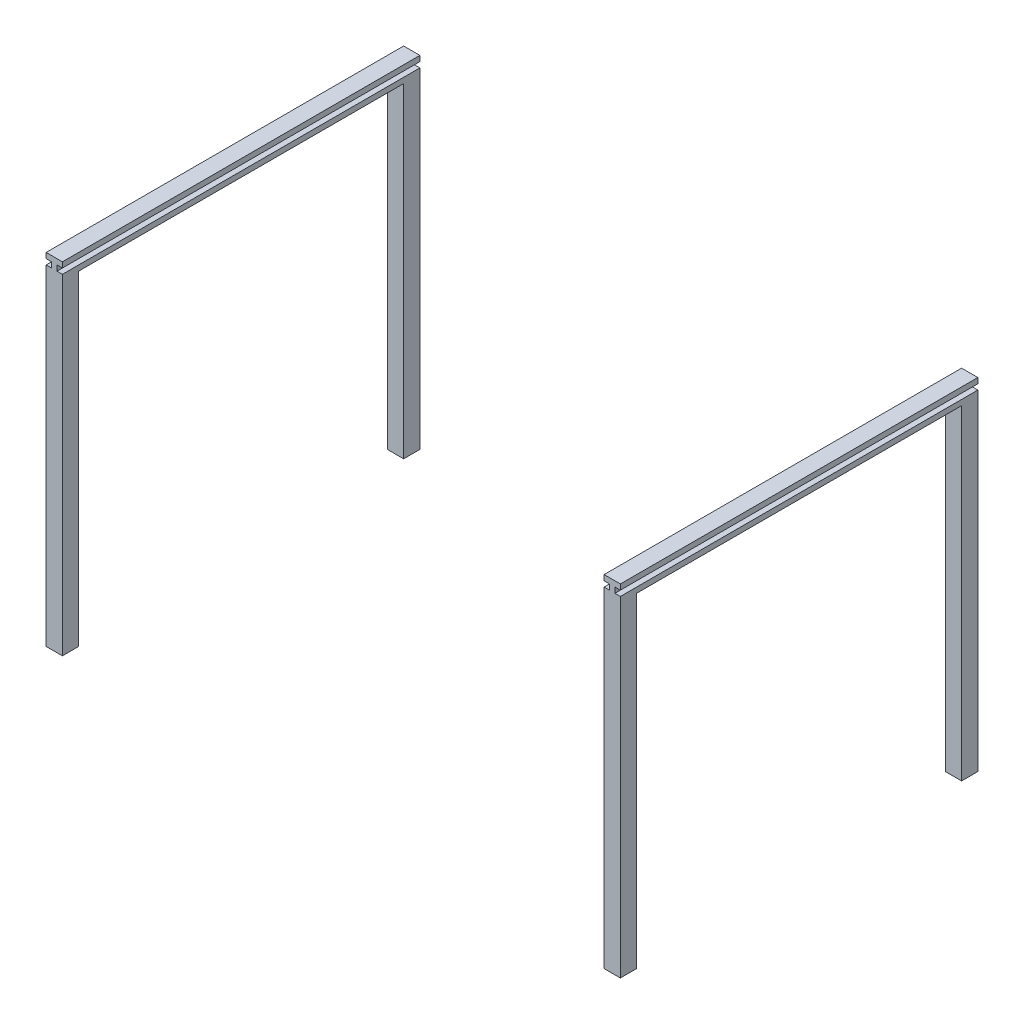
ISO-10303-21;
HEADER;
FILE_DESCRIPTION(('STEP AP214'),'2;1');
FILE_NAME('part.step','',(''),(''),'','','');
FILE_SCHEMA(('AUTOMOTIVE_DESIGN { 1 0 10303 214 1 1 1 1 }'));
ENDSEC;
DATA;
#1=APPLICATION_CONTEXT('core data for automotive mechanical design processes');
#2=APPLICATION_PROTOCOL_DEFINITION('international standard','automotive_design',2000,#1);
#3=PRODUCT_CONTEXT('',#1,'mechanical');
#4=PRODUCT('Part','Part','',(#3));
#5=PRODUCT_RELATED_PRODUCT_CATEGORY('part','',(#4));
#6=PRODUCT_DEFINITION_FORMATION('','',#4);
#7=PRODUCT_DEFINITION_CONTEXT('part definition',#1,'design');
#8=PRODUCT_DEFINITION('design','',#6,#7);
#9=PRODUCT_DEFINITION_SHAPE('','',#8);
#10=(LENGTH_UNIT() NAMED_UNIT(*) SI_UNIT(.MILLI.,.METRE.));
#11=(NAMED_UNIT(*) PLANE_ANGLE_UNIT() SI_UNIT($,.RADIAN.));
#12=(NAMED_UNIT(*) SI_UNIT($,.STERADIAN.) SOLID_ANGLE_UNIT());
#13=UNCERTAINTY_MEASURE_WITH_UNIT(LENGTH_MEASURE(1.E-05),#10,'distance_accuracy_value','');
#14=(GEOMETRIC_REPRESENTATION_CONTEXT(3) GLOBAL_UNCERTAINTY_ASSIGNED_CONTEXT((#13)) GLOBAL_UNIT_ASSIGNED_CONTEXT((#10,
#11,#12)) REPRESENTATION_CONTEXT('',''));
#15=CARTESIAN_POINT('',(0.,0.,0.));
#16=DIRECTION('',(0.,0.,1.));
#17=DIRECTION('',(1.,0.,0.));
#18=AXIS2_PLACEMENT_3D('',#15,#16,#17);
#19=CARTESIAN_POINT('',(2500.,3000.,-1650.));
#20=DIRECTION('',(0.,-1.,0.));
#21=DIRECTION('',(0.,0.,-1.));
#22=AXIS2_PLACEMENT_3D('',#19,#20,#21);
#23=PLANE('',#22);
#24=DIRECTION('',(0.,0.,1.));
#25=VECTOR('',#24,1.);
#26=CARTESIAN_POINT('',(2650.,3000.,-1650.));
#27=LINE('',#26,#25);
#28=CARTESIAN_POINT('',(2650.,3000.,-1500.));
#29=VERTEX_POINT('',#28);
#30=CARTESIAN_POINT('',(2650.,3000.,1500.));
#31=VERTEX_POINT('',#30);
#32=EDGE_CURVE('E117',#29,#31,#27,.T.);
#33=ORIENTED_EDGE('',*,*,#32,.T.);
#34=DIRECTION('',(-1.,0.,0.));
#35=VECTOR('',#34,1.);
#36=CARTESIAN_POINT('',(2650.,3000.,1500.));
#37=LINE('',#36,#35);
#38=CARTESIAN_POINT('',(2500.,3000.,1500.));
#39=VERTEX_POINT('',#38);
#40=EDGE_CURVE('E125',#31,#39,#37,.T.);
#41=ORIENTED_EDGE('',*,*,#40,.T.);
#42=DIRECTION('',(0.,0.,1.));
#43=VECTOR('',#42,1.);
#44=CARTESIAN_POINT('',(2500.,3000.,-1650.));
#45=LINE('',#44,#43);
#46=CARTESIAN_POINT('',(2500.,3000.,-1500.));
#47=VERTEX_POINT('',#46);
#48=EDGE_CURVE('E122',#47,#39,#45,.T.);
#49=ORIENTED_EDGE('',*,*,#48,.F.);
#50=DIRECTION('',(1.,0.,0.));
#51=VECTOR('',#50,1.);
#52=CARTESIAN_POINT('',(2650.,3000.,-1500.));
#53=LINE('',#52,#51);
#54=EDGE_CURVE('E95',#47,#29,#53,.T.);
#55=ORIENTED_EDGE('',*,*,#54,.T.);
#56=EDGE_LOOP('',(#33,#41,#49,#55));
#57=FACE_BOUND('',#56,.T.);
#58=ADVANCED_FACE('F48',(#57),#23,.T.);
#59=CARTESIAN_POINT('',(2650.,3000.,-1650.));
#60=DIRECTION('',(-1.,0.,0.));
#61=DIRECTION('',(0.,0.,1.));
#62=AXIS2_PLACEMENT_3D('',#59,#60,#61);
#63=PLANE('',#62);
#64=DIRECTION('',(0.,0.,-1.));
#65=VECTOR('',#64,1.);
#66=CARTESIAN_POINT('',(2650.,0.,-1650.));
#67=LINE('',#66,#65);
#68=CARTESIAN_POINT('',(2650.,0.,-1500.));
#69=VERTEX_POINT('',#68);
#70=CARTESIAN_POINT('',(2650.,0.,-1650.));
#71=VERTEX_POINT('',#70);
#72=EDGE_CURVE('E103',#69,#71,#67,.T.);
#73=ORIENTED_EDGE('',*,*,#72,.T.);
#74=DIRECTION('',(0.,-1.,0.));
#75=VECTOR('',#74,1.);
#76=CARTESIAN_POINT('',(2650.,3000.,-1650.));
#77=LINE('',#76,#75);
#78=CARTESIAN_POINT('',(2650.,3050.,-1650.));
#79=VERTEX_POINT('',#78);
#80=EDGE_CURVE('E12',#79,#71,#77,.T.);
#81=ORIENTED_EDGE('',*,*,#80,.F.);
#82=DIRECTION('',(0.,0.,1.));
#83=VECTOR('',#82,1.);
#84=CARTESIAN_POINT('',(2650.,3050.,-1650.));
#85=LINE('',#84,#83);
#86=CARTESIAN_POINT('',(2650.,3050.,1650.));
#87=VERTEX_POINT('',#86);
#88=EDGE_CURVE('E132',#79,#87,#85,.T.);
#89=ORIENTED_EDGE('',*,*,#88,.T.);
#90=DIRECTION('',(0.,1.,0.));
#91=VECTOR('',#90,1.);
#92=CARTESIAN_POINT('',(2650.,3000.,1650.));
#93=LINE('',#92,#91);
#94=CARTESIAN_POINT('',(2650.,0.,1650.));
#95=VERTEX_POINT('',#94);
#96=EDGE_CURVE('E215',#95,#87,#93,.T.);
#97=ORIENTED_EDGE('',*,*,#96,.F.);
#98=DIRECTION('',(0.,0.,-1.));
#99=VECTOR('',#98,1.);
#100=CARTESIAN_POINT('',(2650.,0.,1650.));
#101=LINE('',#100,#99);
#102=CARTESIAN_POINT('',(2650.,0.,1500.));
#103=VERTEX_POINT('',#102);
#104=EDGE_CURVE('E289',#95,#103,#101,.T.);
#105=ORIENTED_EDGE('',*,*,#104,.T.);
#106=DIRECTION('',(0.,-1.,0.));
#107=VECTOR('',#106,1.);
#108=CARTESIAN_POINT('',(2650.,3000.,1500.));
#109=LINE('',#108,#107);
#110=EDGE_CURVE('E238',#31,#103,#109,.T.);
#111=ORIENTED_EDGE('',*,*,#110,.F.);
#112=ORIENTED_EDGE('',*,*,#32,.F.);
#113=DIRECTION('',(0.,-1.,0.));
#114=VECTOR('',#113,1.);
#115=CARTESIAN_POINT('',(2650.,3000.,-1500.));
#116=LINE('',#115,#114);
#117=EDGE_CURVE('E98',#29,#69,#116,.T.);
#118=ORIENTED_EDGE('',*,*,#117,.T.);
#119=EDGE_LOOP('',(#73,#81,#89,#97,#105,#111,#112,#118));
#120=FACE_BOUND('',#119,.T.);
#121=ADVANCED_FACE('F50',(#120),#63,.F.);
#122=CARTESIAN_POINT('',(2650.,3000.,-1650.));
#123=DIRECTION('',(0.,0.,1.));
#124=DIRECTION('',(1.,0.,0.));
#125=AXIS2_PLACEMENT_3D('',#122,#123,#124);
#126=PLANE('',#125);
#127=DIRECTION('',(-1.,0.,0.));
#128=VECTOR('',#127,1.);
#129=CARTESIAN_POINT('',(2650.,0.,-1650.));
#130=LINE('',#129,#128);
#131=CARTESIAN_POINT('',(2500.,0.,-1650.));
#132=VERTEX_POINT('',#131);
#133=EDGE_CURVE('E88',#71,#132,#130,.T.);
#134=ORIENTED_EDGE('',*,*,#133,.T.);
#135=DIRECTION('',(0.,-1.,0.));
#136=VECTOR('',#135,1.);
#137=CARTESIAN_POINT('',(2500.,3000.,-1650.));
#138=LINE('',#137,#136);
#139=CARTESIAN_POINT('',(2500.,3050.,-1650.));
#140=VERTEX_POINT('',#139);
#141=EDGE_CURVE('E58',#140,#132,#138,.T.);
#142=ORIENTED_EDGE('',*,*,#141,.F.);
#143=DIRECTION('',(-1.,0.,0.));
#144=VECTOR('',#143,1.);
#145=CARTESIAN_POINT('',(2500.,3050.,-1650.));
#146=LINE('',#145,#144);
#147=CARTESIAN_POINT('',(2550.,3050.,-1650.));
#148=VERTEX_POINT('',#147);
#149=EDGE_CURVE('E256',#148,#140,#146,.T.);
#150=ORIENTED_EDGE('',*,*,#149,.F.);
#151=DIRECTION('',(0.,-1.,0.));
#152=VECTOR('',#151,1.);
#153=CARTESIAN_POINT('',(2550.,3050.,-1650.));
#154=LINE('',#153,#152);
#155=CARTESIAN_POINT('',(2550.,3100.,-1650.));
#156=VERTEX_POINT('',#155);
#157=EDGE_CURVE('E260',#156,#148,#154,.T.);
#158=ORIENTED_EDGE('',*,*,#157,.F.);
#159=DIRECTION('',(1.,0.,0.));
#160=VECTOR('',#159,1.);
#161=CARTESIAN_POINT('',(2550.,3100.,-1650.));
#162=LINE('',#161,#160);
#163=CARTESIAN_POINT('',(2500.,3100.,-1650.));
#164=VERTEX_POINT('',#163);
#165=EDGE_CURVE('E264',#164,#156,#162,.T.);
#166=ORIENTED_EDGE('',*,*,#165,.F.);
#167=DIRECTION('',(0.,-1.,0.));
#168=VECTOR('',#167,1.);
#169=CARTESIAN_POINT('',(2500.,3100.,-1650.));
#170=LINE('',#169,#168);
#171=CARTESIAN_POINT('',(2500.,3150.,-1650.));
#172=VERTEX_POINT('',#171);
#173=EDGE_CURVE('E200',#172,#164,#170,.T.);
#174=ORIENTED_EDGE('',*,*,#173,.F.);
#175=DIRECTION('',(-1.,0.,0.));
#176=VECTOR('',#175,1.);
#177=CARTESIAN_POINT('',(2500.,3150.,-1650.));
#178=LINE('',#177,#176);
#179=CARTESIAN_POINT('',(2650.,3150.,-1650.));
#180=VERTEX_POINT('',#179);
#181=EDGE_CURVE('E149',#180,#172,#178,.T.);
#182=ORIENTED_EDGE('',*,*,#181,.F.);
#183=DIRECTION('',(0.,1.,0.));
#184=VECTOR('',#183,1.);
#185=CARTESIAN_POINT('',(2650.,3100.,-1650.));
#186=LINE('',#185,#184);
#187=CARTESIAN_POINT('',(2650.,3100.,-1650.));
#188=VERTEX_POINT('',#187);
#189=EDGE_CURVE('E242',#188,#180,#186,.T.);
#190=ORIENTED_EDGE('',*,*,#189,.F.);
#191=DIRECTION('',(1.,0.,0.));
#192=VECTOR('',#191,1.);
#193=CARTESIAN_POINT('',(2600.,3100.,-1650.));
#194=LINE('',#193,#192);
#195=CARTESIAN_POINT('',(2600.,3100.,-1650.));
#196=VERTEX_POINT('',#195);
#197=EDGE_CURVE('E246',#196,#188,#194,.T.);
#198=ORIENTED_EDGE('',*,*,#197,.F.);
#199=DIRECTION('',(0.,1.,0.));
#200=VECTOR('',#199,1.);
#201=CARTESIAN_POINT('',(2600.,3050.,-1650.));
#202=LINE('',#201,#200);
#203=CARTESIAN_POINT('',(2600.,3050.,-1650.));
#204=VERTEX_POINT('',#203);
#205=EDGE_CURVE('E250',#204,#196,#202,.T.);
#206=ORIENTED_EDGE('',*,*,#205,.F.);
#207=DIRECTION('',(-1.,0.,0.));
#208=VECTOR('',#207,1.);
#209=CARTESIAN_POINT('',(2650.,3050.,-1650.));
#210=LINE('',#209,#208);
#211=EDGE_CURVE('E162',#79,#204,#210,.T.);
#212=ORIENTED_EDGE('',*,*,#211,.F.);
#213=ORIENTED_EDGE('',*,*,#80,.T.);
#214=EDGE_LOOP('',(#134,#142,#150,#158,#166,#174,#182,#190,#198,#206,#212,#213));
#215=FACE_BOUND('',#214,.T.);
#216=ADVANCED_FACE('F155',(#215),#126,.F.);
#217=CARTESIAN_POINT('',(2500.,3000.,-1650.));
#218=DIRECTION('',(1.,0.,0.));
#219=DIRECTION('',(0.,0.,-1.));
#220=AXIS2_PLACEMENT_3D('',#217,#218,#219);
#221=PLANE('',#220);
#222=DIRECTION('',(0.,0.,1.));
#223=VECTOR('',#222,1.);
#224=CARTESIAN_POINT('',(2500.,0.,-1650.));
#225=LINE('',#224,#223);
#226=CARTESIAN_POINT('',(2500.,0.,-1500.));
#227=VERTEX_POINT('',#226);
#228=EDGE_CURVE('E80',#132,#227,#225,.T.);
#229=ORIENTED_EDGE('',*,*,#228,.T.);
#230=DIRECTION('',(0.,-1.,0.));
#231=VECTOR('',#230,1.);
#232=CARTESIAN_POINT('',(2500.,3000.,-1500.));
#233=LINE('',#232,#231);
#234=EDGE_CURVE('E65',#47,#227,#233,.T.);
#235=ORIENTED_EDGE('',*,*,#234,.F.);
#236=ORIENTED_EDGE('',*,*,#48,.T.);
#237=DIRECTION('',(0.,-1.,0.));
#238=VECTOR('',#237,1.);
#239=CARTESIAN_POINT('',(2500.,3000.,1500.));
#240=LINE('',#239,#238);
#241=CARTESIAN_POINT('',(2500.,0.,1500.));
#242=VERTEX_POINT('',#241);
#243=EDGE_CURVE('E274',#39,#242,#240,.T.);
#244=ORIENTED_EDGE('',*,*,#243,.T.);
#245=DIRECTION('',(0.,0.,1.));
#246=VECTOR('',#245,1.);
#247=CARTESIAN_POINT('',(2500.,0.,1650.));
#248=LINE('',#247,#246);
#249=CARTESIAN_POINT('',(2500.,0.,1650.));
#250=VERTEX_POINT('',#249);
#251=EDGE_CURVE('E281',#242,#250,#248,.T.);
#252=ORIENTED_EDGE('',*,*,#251,.T.);
#253=DIRECTION('',(0.,-1.,0.));
#254=VECTOR('',#253,1.);
#255=CARTESIAN_POINT('',(2500.,3000.,1650.));
#256=LINE('',#255,#254);
#257=CARTESIAN_POINT('',(2500.,3050.,1650.));
#258=VERTEX_POINT('',#257);
#259=EDGE_CURVE('E218',#258,#250,#256,.T.);
#260=ORIENTED_EDGE('',*,*,#259,.F.);
#261=DIRECTION('',(0.,0.,1.));
#262=VECTOR('',#261,1.);
#263=CARTESIAN_POINT('',(2500.,3050.,-1650.));
#264=LINE('',#263,#262);
#265=EDGE_CURVE('E128',#140,#258,#264,.T.);
#266=ORIENTED_EDGE('',*,*,#265,.F.);
#267=ORIENTED_EDGE('',*,*,#141,.T.);
#268=EDGE_LOOP('',(#229,#235,#236,#244,#252,#260,#266,#267));
#269=FACE_BOUND('',#268,.T.);
#270=ADVANCED_FACE('F81',(#269),#221,.F.);
#271=CARTESIAN_POINT('',(2650.,3000.,-1500.));
#272=DIRECTION('',(0.,0.,-1.));
#273=DIRECTION('',(-1.,0.,0.));
#274=AXIS2_PLACEMENT_3D('',#271,#272,#273);
#275=PLANE('',#274);
#276=DIRECTION('',(1.,0.,0.));
#277=VECTOR('',#276,1.);
#278=CARTESIAN_POINT('',(2650.,0.,-1500.));
#279=LINE('',#278,#277);
#280=EDGE_CURVE('E87',#227,#69,#279,.T.);
#281=ORIENTED_EDGE('',*,*,#280,.T.);
#282=ORIENTED_EDGE('',*,*,#117,.F.);
#283=ORIENTED_EDGE('',*,*,#54,.F.);
#284=ORIENTED_EDGE('',*,*,#234,.T.);
#285=EDGE_LOOP('',(#281,#282,#283,#284));
#286=FACE_BOUND('',#285,.T.);
#287=ADVANCED_FACE('F91',(#286),#275,.F.);
#288=CARTESIAN_POINT('',(0.,0.,0.));
#289=DIRECTION('',(0.,-1.,0.));
#290=DIRECTION('',(0.,0.,-1.));
#291=AXIS2_PLACEMENT_3D('',#288,#289,#290);
#292=PLANE('',#291);
#293=ORIENTED_EDGE('',*,*,#72,.F.);
#294=ORIENTED_EDGE('',*,*,#280,.F.);
#295=ORIENTED_EDGE('',*,*,#228,.F.);
#296=ORIENTED_EDGE('',*,*,#133,.F.);
#297=EDGE_LOOP('',(#293,#294,#295,#296));
#298=FACE_BOUND('',#297,.T.);
#299=ADVANCED_FACE('F101',(#298),#292,.T.);
#300=CARTESIAN_POINT('',(2500.,3100.,-1650.));
#301=DIRECTION('',(-1.,0.,0.));
#302=DIRECTION('',(0.,0.,1.));
#303=AXIS2_PLACEMENT_3D('',#300,#301,#302);
#304=PLANE('',#303);
#305=DIRECTION('',(0.,-1.,0.));
#306=VECTOR('',#305,1.);
#307=CARTESIAN_POINT('',(2500.,3100.,1650.));
#308=LINE('',#307,#306);
#309=CARTESIAN_POINT('',(2500.,3150.,1650.));
#310=VERTEX_POINT('',#309);
#311=CARTESIAN_POINT('',(2500.,3100.,1650.));
#312=VERTEX_POINT('',#311);
#313=EDGE_CURVE('E234',#310,#312,#308,.T.);
#314=ORIENTED_EDGE('',*,*,#313,.F.);
#315=DIRECTION('',(0.,0.,1.));
#316=VECTOR('',#315,1.);
#317=CARTESIAN_POINT('',(2500.,3150.,-1650.));
#318=LINE('',#317,#316);
#319=EDGE_CURVE('E152',#172,#310,#318,.T.);
#320=ORIENTED_EDGE('',*,*,#319,.F.);
#321=ORIENTED_EDGE('',*,*,#173,.T.);
#322=DIRECTION('',(0.,0.,1.));
#323=VECTOR('',#322,1.);
#324=CARTESIAN_POINT('',(2500.,3100.,-1650.));
#325=LINE('',#324,#323);
#326=EDGE_CURVE('E146',#164,#312,#325,.T.);
#327=ORIENTED_EDGE('',*,*,#326,.T.);
#328=EDGE_LOOP('',(#314,#320,#321,#327));
#329=FACE_BOUND('',#328,.T.);
#330=ADVANCED_FACE('F357',(#329),#304,.T.);
#331=CARTESIAN_POINT('',(2500.,3150.,-1650.));
#332=DIRECTION('',(0.,1.,0.));
#333=DIRECTION('',(0.,0.,1.));
#334=AXIS2_PLACEMENT_3D('',#331,#332,#333);
#335=PLANE('',#334);
#336=DIRECTION('',(-1.,0.,0.));
#337=VECTOR('',#336,1.);
#338=CARTESIAN_POINT('',(2500.,3150.,1650.));
#339=LINE('',#338,#337);
#340=CARTESIAN_POINT('',(2650.,3150.,1650.));
#341=VERTEX_POINT('',#340);
#342=EDGE_CURVE('E196',#341,#310,#339,.T.);
#343=ORIENTED_EDGE('',*,*,#342,.F.);
#344=DIRECTION('',(0.,0.,1.));
#345=VECTOR('',#344,1.);
#346=CARTESIAN_POINT('',(2650.,3150.,-1650.));
#347=LINE('',#346,#345);
#348=EDGE_CURVE('E189',#180,#341,#347,.T.);
#349=ORIENTED_EDGE('',*,*,#348,.F.);
#350=ORIENTED_EDGE('',*,*,#181,.T.);
#351=ORIENTED_EDGE('',*,*,#319,.T.);
#352=EDGE_LOOP('',(#343,#349,#350,#351));
#353=FACE_BOUND('',#352,.T.);
#354=ADVANCED_FACE('F353',(#353),#335,.T.);
#355=CARTESIAN_POINT('',(2650.,3100.,-1650.));
#356=DIRECTION('',(1.,0.,0.));
#357=DIRECTION('',(0.,0.,-1.));
#358=AXIS2_PLACEMENT_3D('',#355,#356,#357);
#359=PLANE('',#358);
#360=DIRECTION('',(0.,1.,0.));
#361=VECTOR('',#360,1.);
#362=CARTESIAN_POINT('',(2650.,3100.,1650.));
#363=LINE('',#362,#361);
#364=CARTESIAN_POINT('',(2650.,3100.,1650.));
#365=VERTEX_POINT('',#364);
#366=EDGE_CURVE('E201',#365,#341,#363,.T.);
#367=ORIENTED_EDGE('',*,*,#366,.F.);
#368=DIRECTION('',(0.,0.,1.));
#369=VECTOR('',#368,1.);
#370=CARTESIAN_POINT('',(2650.,3100.,-1650.));
#371=LINE('',#370,#369);
#372=EDGE_CURVE('E185',#188,#365,#371,.T.);
#373=ORIENTED_EDGE('',*,*,#372,.F.);
#374=ORIENTED_EDGE('',*,*,#189,.T.);
#375=ORIENTED_EDGE('',*,*,#348,.T.);
#376=EDGE_LOOP('',(#367,#373,#374,#375));
#377=FACE_BOUND('',#376,.T.);
#378=ADVANCED_FACE('F364',(#377),#359,.T.);
#379=CARTESIAN_POINT('',(2600.,3100.,-1650.));
#380=DIRECTION('',(0.,-1.,0.));
#381=DIRECTION('',(0.,0.,-1.));
#382=AXIS2_PLACEMENT_3D('',#379,#380,#381);
#383=PLANE('',#382);
#384=DIRECTION('',(1.,0.,0.));
#385=VECTOR('',#384,1.);
#386=CARTESIAN_POINT('',(2600.,3100.,1650.));
#387=LINE('',#386,#385);
#388=CARTESIAN_POINT('',(2600.,3100.,1650.));
#389=VERTEX_POINT('',#388);
#390=EDGE_CURVE('E205',#389,#365,#387,.T.);
#391=ORIENTED_EDGE('',*,*,#390,.F.);
#392=DIRECTION('',(0.,0.,1.));
#393=VECTOR('',#392,1.);
#394=CARTESIAN_POINT('',(2600.,3100.,-1650.));
#395=LINE('',#394,#393);
#396=EDGE_CURVE('E179',#196,#389,#395,.T.);
#397=ORIENTED_EDGE('',*,*,#396,.F.);
#398=ORIENTED_EDGE('',*,*,#197,.T.);
#399=ORIENTED_EDGE('',*,*,#372,.T.);
#400=EDGE_LOOP('',(#391,#397,#398,#399));
#401=FACE_BOUND('',#400,.T.);
#402=ADVANCED_FACE('F382',(#401),#383,.T.);
#403=CARTESIAN_POINT('',(2600.,3050.,-1650.));
#404=DIRECTION('',(1.,0.,0.));
#405=DIRECTION('',(0.,0.,-1.));
#406=AXIS2_PLACEMENT_3D('',#403,#404,#405);
#407=PLANE('',#406);
#408=DIRECTION('',(0.,1.,0.));
#409=VECTOR('',#408,1.);
#410=CARTESIAN_POINT('',(2600.,3050.,1650.));
#411=LINE('',#410,#409);
#412=CARTESIAN_POINT('',(2600.,3050.,1650.));
#413=VERTEX_POINT('',#412);
#414=EDGE_CURVE('E209',#413,#389,#411,.T.);
#415=ORIENTED_EDGE('',*,*,#414,.F.);
#416=DIRECTION('',(0.,0.,1.));
#417=VECTOR('',#416,1.);
#418=CARTESIAN_POINT('',(2600.,3050.,-1650.));
#419=LINE('',#418,#417);
#420=EDGE_CURVE('E177',#204,#413,#419,.T.);
#421=ORIENTED_EDGE('',*,*,#420,.F.);
#422=ORIENTED_EDGE('',*,*,#205,.T.);
#423=ORIENTED_EDGE('',*,*,#396,.T.);
#424=EDGE_LOOP('',(#415,#421,#422,#423));
#425=FACE_BOUND('',#424,.T.);
#426=ADVANCED_FACE('F380',(#425),#407,.T.);
#427=CARTESIAN_POINT('',(2650.,3050.,-1650.));
#428=DIRECTION('',(0.,1.,0.));
#429=DIRECTION('',(0.,0.,1.));
#430=AXIS2_PLACEMENT_3D('',#427,#428,#429);
#431=PLANE('',#430);
#432=DIRECTION('',(-1.,0.,0.));
#433=VECTOR('',#432,1.);
#434=CARTESIAN_POINT('',(2650.,3050.,1650.));
#435=LINE('',#434,#433);
#436=EDGE_CURVE('E174',#87,#413,#435,.T.);
#437=ORIENTED_EDGE('',*,*,#436,.F.);
#438=ORIENTED_EDGE('',*,*,#88,.F.);
#439=ORIENTED_EDGE('',*,*,#211,.T.);
#440=ORIENTED_EDGE('',*,*,#420,.T.);
#441=EDGE_LOOP('',(#437,#438,#439,#440));
#442=FACE_BOUND('',#441,.T.);
#443=ADVANCED_FACE('F171',(#442),#431,.T.);
#444=CARTESIAN_POINT('',(2500.,3050.,-1650.));
#445=DIRECTION('',(0.,1.,0.));
#446=DIRECTION('',(0.,0.,1.));
#447=AXIS2_PLACEMENT_3D('',#444,#445,#446);
#448=PLANE('',#447);
#449=DIRECTION('',(-1.,0.,0.));
#450=VECTOR('',#449,1.);
#451=CARTESIAN_POINT('',(2500.,3050.,1650.));
#452=LINE('',#451,#450);
#453=CARTESIAN_POINT('',(2550.,3050.,1650.));
#454=VERTEX_POINT('',#453);
#455=EDGE_CURVE('E222',#454,#258,#452,.T.);
#456=ORIENTED_EDGE('',*,*,#455,.F.);
#457=DIRECTION('',(0.,0.,1.));
#458=VECTOR('',#457,1.);
#459=CARTESIAN_POINT('',(2550.,3050.,-1650.));
#460=LINE('',#459,#458);
#461=EDGE_CURVE('E135',#148,#454,#460,.T.);
#462=ORIENTED_EDGE('',*,*,#461,.F.);
#463=ORIENTED_EDGE('',*,*,#149,.T.);
#464=ORIENTED_EDGE('',*,*,#265,.T.);
#465=EDGE_LOOP('',(#456,#462,#463,#464));
#466=FACE_BOUND('',#465,.T.);
#467=ADVANCED_FACE('F376',(#466),#448,.T.);
#468=CARTESIAN_POINT('',(2550.,3050.,-1650.));
#469=DIRECTION('',(-1.,0.,0.));
#470=DIRECTION('',(0.,0.,1.));
#471=AXIS2_PLACEMENT_3D('',#468,#469,#470);
#472=PLANE('',#471);
#473=DIRECTION('',(0.,-1.,0.));
#474=VECTOR('',#473,1.);
#475=CARTESIAN_POINT('',(2550.,3050.,1650.));
#476=LINE('',#475,#474);
#477=CARTESIAN_POINT('',(2550.,3100.,1650.));
#478=VERTEX_POINT('',#477);
#479=EDGE_CURVE('E226',#478,#454,#476,.T.);
#480=ORIENTED_EDGE('',*,*,#479,.F.);
#481=DIRECTION('',(0.,0.,1.));
#482=VECTOR('',#481,1.);
#483=CARTESIAN_POINT('',(2550.,3100.,-1650.));
#484=LINE('',#483,#482);
#485=EDGE_CURVE('E142',#156,#478,#484,.T.);
#486=ORIENTED_EDGE('',*,*,#485,.F.);
#487=ORIENTED_EDGE('',*,*,#157,.T.);
#488=ORIENTED_EDGE('',*,*,#461,.T.);
#489=EDGE_LOOP('',(#480,#486,#487,#488));
#490=FACE_BOUND('',#489,.T.);
#491=ADVANCED_FACE('F374',(#490),#472,.T.);
#492=CARTESIAN_POINT('',(2550.,3100.,-1650.));
#493=DIRECTION('',(0.,-1.,0.));
#494=DIRECTION('',(0.,0.,-1.));
#495=AXIS2_PLACEMENT_3D('',#492,#493,#494);
#496=PLANE('',#495);
#497=DIRECTION('',(1.,0.,0.));
#498=VECTOR('',#497,1.);
#499=CARTESIAN_POINT('',(2550.,3100.,1650.));
#500=LINE('',#499,#498);
#501=EDGE_CURVE('E230',#312,#478,#500,.T.);
#502=ORIENTED_EDGE('',*,*,#501,.F.);
#503=ORIENTED_EDGE('',*,*,#326,.F.);
#504=ORIENTED_EDGE('',*,*,#165,.T.);
#505=ORIENTED_EDGE('',*,*,#485,.T.);
#506=EDGE_LOOP('',(#502,#503,#504,#505));
#507=FACE_BOUND('',#506,.T.);
#508=ADVANCED_FACE('F370',(#507),#496,.T.);
#509=CARTESIAN_POINT('',(0.,0.,1650.));
#510=DIRECTION('',(0.,0.,-1.));
#511=DIRECTION('',(-1.,0.,0.));
#512=AXIS2_PLACEMENT_3D('',#509,#510,#511);
#513=PLANE('',#512);
#514=ORIENTED_EDGE('',*,*,#313,.T.);
#515=ORIENTED_EDGE('',*,*,#501,.T.);
#516=ORIENTED_EDGE('',*,*,#479,.T.);
#517=ORIENTED_EDGE('',*,*,#455,.T.);
#518=ORIENTED_EDGE('',*,*,#259,.T.);
#519=DIRECTION('',(1.,0.,0.));
#520=VECTOR('',#519,1.);
#521=CARTESIAN_POINT('',(2650.,0.,1650.));
#522=LINE('',#521,#520);
#523=EDGE_CURVE('E277',#250,#95,#522,.T.);
#524=ORIENTED_EDGE('',*,*,#523,.T.);
#525=ORIENTED_EDGE('',*,*,#96,.T.);
#526=ORIENTED_EDGE('',*,*,#436,.T.);
#527=ORIENTED_EDGE('',*,*,#414,.T.);
#528=ORIENTED_EDGE('',*,*,#390,.T.);
#529=ORIENTED_EDGE('',*,*,#366,.T.);
#530=ORIENTED_EDGE('',*,*,#342,.T.);
#531=EDGE_LOOP('',(#514,#515,#516,#517,#518,#524,#525,#526,#527,#528,#529,#530));
#532=FACE_BOUND('',#531,.T.);
#533=ADVANCED_FACE('F360',(#532),#513,.F.);
#534=CARTESIAN_POINT('',(2650.,3000.,1500.));
#535=DIRECTION('',(0.,0.,1.));
#536=DIRECTION('',(1.,0.,0.));
#537=AXIS2_PLACEMENT_3D('',#534,#535,#536);
#538=PLANE('',#537);
#539=DIRECTION('',(-1.,0.,0.));
#540=VECTOR('',#539,1.);
#541=CARTESIAN_POINT('',(2650.,0.,1500.));
#542=LINE('',#541,#540);
#543=EDGE_CURVE('E285',#103,#242,#542,.T.);
#544=ORIENTED_EDGE('',*,*,#543,.T.);
#545=ORIENTED_EDGE('',*,*,#243,.F.);
#546=ORIENTED_EDGE('',*,*,#40,.F.);
#547=ORIENTED_EDGE('',*,*,#110,.T.);
#548=EDGE_LOOP('',(#544,#545,#546,#547));
#549=FACE_BOUND('',#548,.T.);
#550=ADVANCED_FACE('F479',(#549),#538,.F.);
#551=CARTESIAN_POINT('',(0.,0.,0.));
#552=DIRECTION('',(0.,1.,0.));
#553=DIRECTION('',(0.,0.,1.));
#554=AXIS2_PLACEMENT_3D('',#551,#552,#553);
#555=PLANE('',#554);
#556=ORIENTED_EDGE('',*,*,#104,.F.);
#557=ORIENTED_EDGE('',*,*,#523,.F.);
#558=ORIENTED_EDGE('',*,*,#251,.F.);
#559=ORIENTED_EDGE('',*,*,#543,.F.);
#560=EDGE_LOOP('',(#556,#557,#558,#559));
#561=FACE_BOUND('',#560,.T.);
#562=ADVANCED_FACE('F302',(#561),#555,.F.);
#563=CLOSED_SHELL('',(#58,#121,#216,#270,#287,#299,#330,#354,#378,#402,#426,#443,#467,#491,#508,
#533,#550,#562));
#564=MANIFOLD_SOLID_BREP('B2',#563);
#565=CARTESIAN_POINT('',(-2500.,3000.,-1650.));
#566=DIRECTION('',(0.,-1.,0.));
#567=DIRECTION('',(0.,0.,-1.));
#568=AXIS2_PLACEMENT_3D('',#565,#566,#567);
#569=PLANE('',#568);
#570=DIRECTION('',(0.,0.,1.));
#571=VECTOR('',#570,1.);
#572=CARTESIAN_POINT('',(-2500.,3000.,-1650.));
#573=LINE('',#572,#571);
#574=CARTESIAN_POINT('',(-2500.,3000.,-1500.));
#575=VERTEX_POINT('',#574);
#576=CARTESIAN_POINT('',(-2500.,3000.,1500.));
#577=VERTEX_POINT('',#576);
#578=EDGE_CURVE('E611',#575,#577,#573,.T.);
#579=ORIENTED_EDGE('',*,*,#578,.T.);
#580=DIRECTION('',(-1.,0.,0.));
#581=VECTOR('',#580,1.);
#582=CARTESIAN_POINT('',(-2650.,3000.,1500.));
#583=LINE('',#582,#581);
#584=CARTESIAN_POINT('',(-2650.,3000.,1500.));
#585=VERTEX_POINT('',#584);
#586=EDGE_CURVE('E619',#577,#585,#583,.T.);
#587=ORIENTED_EDGE('',*,*,#586,.T.);
#588=DIRECTION('',(0.,0.,1.));
#589=VECTOR('',#588,1.);
#590=CARTESIAN_POINT('',(-2650.,3000.,-1650.));
#591=LINE('',#590,#589);
#592=CARTESIAN_POINT('',(-2650.,3000.,-1500.));
#593=VERTEX_POINT('',#592);
#594=EDGE_CURVE('E616',#593,#585,#591,.T.);
#595=ORIENTED_EDGE('',*,*,#594,.F.);
#596=DIRECTION('',(1.,0.,0.));
#597=VECTOR('',#596,1.);
#598=CARTESIAN_POINT('',(-2650.,3000.,-1500.));
#599=LINE('',#598,#597);
#600=EDGE_CURVE('E594',#593,#575,#599,.T.);
#601=ORIENTED_EDGE('',*,*,#600,.T.);
#602=EDGE_LOOP('',(#579,#587,#595,#601));
#603=FACE_BOUND('',#602,.T.);
#604=ADVANCED_FACE('F549',(#603),#569,.T.);
#605=CARTESIAN_POINT('',(-2500.,3000.,-1650.));
#606=DIRECTION('',(-1.,0.,0.));
#607=DIRECTION('',(0.,0.,1.));
#608=AXIS2_PLACEMENT_3D('',#605,#606,#607);
#609=PLANE('',#608);
#610=DIRECTION('',(0.,0.,-1.));
#611=VECTOR('',#610,1.);
#612=CARTESIAN_POINT('',(-2500.,0.,-1650.));
#613=LINE('',#612,#611);
#614=CARTESIAN_POINT('',(-2500.,0.,-1500.));
#615=VERTEX_POINT('',#614);
#616=CARTESIAN_POINT('',(-2500.,0.,-1650.));
#617=VERTEX_POINT('',#616);
#618=EDGE_CURVE('E601',#615,#617,#613,.T.);
#619=ORIENTED_EDGE('',*,*,#618,.T.);
#620=DIRECTION('',(0.,-1.,0.));
#621=VECTOR('',#620,1.);
#622=CARTESIAN_POINT('',(-2500.,3000.,-1650.));
#623=LINE('',#622,#621);
#624=CARTESIAN_POINT('',(-2500.,3050.,-1650.));
#625=VERTEX_POINT('',#624);
#626=EDGE_CURVE('E46',#625,#617,#623,.T.);
#627=ORIENTED_EDGE('',*,*,#626,.F.);
#628=DIRECTION('',(0.,0.,1.));
#629=VECTOR('',#628,1.);
#630=CARTESIAN_POINT('',(-2500.,3050.,-1650.));
#631=LINE('',#630,#629);
#632=CARTESIAN_POINT('',(-2500.,3050.,1650.));
#633=VERTEX_POINT('',#632);
#634=EDGE_CURVE('E652',#625,#633,#631,.T.);
#635=ORIENTED_EDGE('',*,*,#634,.T.);
#636=DIRECTION('',(0.,1.,0.));
#637=VECTOR('',#636,1.);
#638=CARTESIAN_POINT('',(-2500.,3000.,1650.));
#639=LINE('',#638,#637);
#640=CARTESIAN_POINT('',(-2500.,0.,1650.));
#641=VERTEX_POINT('',#640);
#642=EDGE_CURVE('E683',#641,#633,#639,.T.);
#643=ORIENTED_EDGE('',*,*,#642,.F.);
#644=DIRECTION('',(0.,0.,-1.));
#645=VECTOR('',#644,1.);
#646=CARTESIAN_POINT('',(-2500.,0.,1650.));
#647=LINE('',#646,#645);
#648=CARTESIAN_POINT('',(-2500.,0.,1500.));
#649=VERTEX_POINT('',#648);
#650=EDGE_CURVE('E825',#641,#649,#647,.T.);
#651=ORIENTED_EDGE('',*,*,#650,.T.);
#652=DIRECTION('',(0.,-1.,0.));
#653=VECTOR('',#652,1.);
#654=CARTESIAN_POINT('',(-2500.,3000.,1500.));
#655=LINE('',#654,#653);
#656=EDGE_CURVE('E693',#577,#649,#655,.T.);
#657=ORIENTED_EDGE('',*,*,#656,.F.);
#658=ORIENTED_EDGE('',*,*,#578,.F.);
#659=DIRECTION('',(0.,-1.,0.));
#660=VECTOR('',#659,1.);
#661=CARTESIAN_POINT('',(-2500.,3000.,-1500.));
#662=LINE('',#661,#660);
#663=EDGE_CURVE('E596',#575,#615,#662,.T.);
#664=ORIENTED_EDGE('',*,*,#663,.T.);
#665=EDGE_LOOP('',(#619,#627,#635,#643,#651,#657,#658,#664));
#666=FACE_BOUND('',#665,.T.);
#667=ADVANCED_FACE('F551',(#666),#609,.F.);
#668=CARTESIAN_POINT('',(-2650.,3000.,-1650.));
#669=DIRECTION('',(0.,0.,1.));
#670=DIRECTION('',(1.,0.,0.));
#671=AXIS2_PLACEMENT_3D('',#668,#669,#670);
#672=PLANE('',#671);
#673=DIRECTION('',(-1.,0.,0.));
#674=VECTOR('',#673,1.);
#675=CARTESIAN_POINT('',(-2650.,0.,-1650.));
#676=LINE('',#675,#674);
#677=CARTESIAN_POINT('',(-2650.,0.,-1650.));
#678=VERTEX_POINT('',#677);
#679=EDGE_CURVE('E587',#617,#678,#676,.T.);
#680=ORIENTED_EDGE('',*,*,#679,.T.);
#681=DIRECTION('',(0.,-1.,0.));
#682=VECTOR('',#681,1.);
#683=CARTESIAN_POINT('',(-2650.,3000.,-1650.));
#684=LINE('',#683,#682);
#685=CARTESIAN_POINT('',(-2650.,3050.,-1650.));
#686=VERTEX_POINT('',#685);
#687=EDGE_CURVE('E558',#686,#678,#684,.T.);
#688=ORIENTED_EDGE('',*,*,#687,.F.);
#689=DIRECTION('',(-1.,0.,0.));
#690=VECTOR('',#689,1.);
#691=CARTESIAN_POINT('',(-2650.,3050.,-1650.));
#692=LINE('',#691,#690);
#693=CARTESIAN_POINT('',(-2600.,3050.,-1650.));
#694=VERTEX_POINT('',#693);
#695=EDGE_CURVE('E654',#694,#686,#692,.T.);
#696=ORIENTED_EDGE('',*,*,#695,.F.);
#697=DIRECTION('',(0.,-1.,0.));
#698=VECTOR('',#697,1.);
#699=CARTESIAN_POINT('',(-2600.,3050.,-1650.));
#700=LINE('',#699,#698);
#701=CARTESIAN_POINT('',(-2600.,3100.,-1650.));
#702=VERTEX_POINT('',#701);
#703=EDGE_CURVE('E745',#702,#694,#700,.T.);
#704=ORIENTED_EDGE('',*,*,#703,.F.);
#705=DIRECTION('',(1.,0.,0.));
#706=VECTOR('',#705,1.);
#707=CARTESIAN_POINT('',(-2600.,3100.,-1650.));
#708=LINE('',#707,#706);
#709=CARTESIAN_POINT('',(-2650.,3100.,-1650.));
#710=VERTEX_POINT('',#709);
#711=EDGE_CURVE('E743',#710,#702,#708,.T.);
#712=ORIENTED_EDGE('',*,*,#711,.F.);
#713=DIRECTION('',(0.,-1.,0.));
#714=VECTOR('',#713,1.);
#715=CARTESIAN_POINT('',(-2650.,3100.,-1650.));
#716=LINE('',#715,#714);
#717=CARTESIAN_POINT('',(-2650.,3150.,-1650.));
#718=VERTEX_POINT('',#717);
#719=EDGE_CURVE('E740',#718,#710,#716,.T.);
#720=ORIENTED_EDGE('',*,*,#719,.F.);
#721=DIRECTION('',(-1.,0.,0.));
#722=VECTOR('',#721,1.);
#723=CARTESIAN_POINT('',(-2500.,3150.,-1650.));
#724=LINE('',#723,#722);
#725=CARTESIAN_POINT('',(-2500.,3150.,-1650.));
#726=VERTEX_POINT('',#725);
#727=EDGE_CURVE('E737',#726,#718,#724,.T.);
#728=ORIENTED_EDGE('',*,*,#727,.F.);
#729=DIRECTION('',(0.,1.,0.));
#730=VECTOR('',#729,1.);
#731=CARTESIAN_POINT('',(-2500.,3100.,-1650.));
#732=LINE('',#731,#730);
#733=CARTESIAN_POINT('',(-2500.,3100.,-1650.));
#734=VERTEX_POINT('',#733);
#735=EDGE_CURVE('E734',#734,#726,#732,.T.);
#736=ORIENTED_EDGE('',*,*,#735,.F.);
#737=DIRECTION('',(1.,0.,0.));
#738=VECTOR('',#737,1.);
#739=CARTESIAN_POINT('',(-2550.,3100.,-1650.));
#740=LINE('',#739,#738);
#741=CARTESIAN_POINT('',(-2550.,3100.,-1650.));
#742=VERTEX_POINT('',#741);
#743=EDGE_CURVE('E728',#742,#734,#740,.T.);
#744=ORIENTED_EDGE('',*,*,#743,.F.);
#745=DIRECTION('',(0.,1.,0.));
#746=VECTOR('',#745,1.);
#747=CARTESIAN_POINT('',(-2550.,3050.,-1650.));
#748=LINE('',#747,#746);
#749=CARTESIAN_POINT('',(-2550.,3050.,-1650.));
#750=VERTEX_POINT('',#749);
#751=EDGE_CURVE('E725',#750,#742,#748,.T.);
#752=ORIENTED_EDGE('',*,*,#751,.F.);
#753=DIRECTION('',(-1.,0.,0.));
#754=VECTOR('',#753,1.);
#755=CARTESIAN_POINT('',(-2500.,3050.,-1650.));
#756=LINE('',#755,#754);
#757=EDGE_CURVE('E663',#625,#750,#756,.T.);
#758=ORIENTED_EDGE('',*,*,#757,.F.);
#759=ORIENTED_EDGE('',*,*,#626,.T.);
#760=EDGE_LOOP('',(#680,#688,#696,#704,#712,#720,#728,#736,#744,#752,#758,#759));
#761=FACE_BOUND('',#760,.T.);
#762=ADVANCED_FACE('F657',(#761),#672,.F.);
#763=CARTESIAN_POINT('',(-2650.,3000.,-1650.));
#764=DIRECTION('',(1.,0.,0.));
#765=DIRECTION('',(0.,0.,-1.));
#766=AXIS2_PLACEMENT_3D('',#763,#764,#765);
#767=PLANE('',#766);
#768=DIRECTION('',(0.,0.,1.));
#769=VECTOR('',#768,1.);
#770=CARTESIAN_POINT('',(-2650.,0.,-1650.));
#771=LINE('',#770,#769);
#772=CARTESIAN_POINT('',(-2650.,0.,-1500.));
#773=VERTEX_POINT('',#772);
#774=EDGE_CURVE('E580',#678,#773,#771,.T.);
#775=ORIENTED_EDGE('',*,*,#774,.T.);
#776=DIRECTION('',(0.,-1.,0.));
#777=VECTOR('',#776,1.);
#778=CARTESIAN_POINT('',(-2650.,3000.,-1500.));
#779=LINE('',#778,#777);
#780=EDGE_CURVE('E565',#593,#773,#779,.T.);
#781=ORIENTED_EDGE('',*,*,#780,.F.);
#782=ORIENTED_EDGE('',*,*,#594,.T.);
#783=DIRECTION('',(0.,-1.,0.));
#784=VECTOR('',#783,1.);
#785=CARTESIAN_POINT('',(-2650.,3000.,1500.));
#786=LINE('',#785,#784);
#787=CARTESIAN_POINT('',(-2650.,0.,1500.));
#788=VERTEX_POINT('',#787);
#789=EDGE_CURVE('E696',#585,#788,#786,.T.);
#790=ORIENTED_EDGE('',*,*,#789,.T.);
#791=DIRECTION('',(0.,0.,1.));
#792=VECTOR('',#791,1.);
#793=CARTESIAN_POINT('',(-2650.,0.,1650.));
#794=LINE('',#793,#792);
#795=CARTESIAN_POINT('',(-2650.,0.,1650.));
#796=VERTEX_POINT('',#795);
#797=EDGE_CURVE('E833',#788,#796,#794,.T.);
#798=ORIENTED_EDGE('',*,*,#797,.T.);
#799=DIRECTION('',(0.,-1.,0.));
#800=VECTOR('',#799,1.);
#801=CARTESIAN_POINT('',(-2650.,3000.,1650.));
#802=LINE('',#801,#800);
#803=CARTESIAN_POINT('',(-2650.,3050.,1650.));
#804=VERTEX_POINT('',#803);
#805=EDGE_CURVE('E722',#804,#796,#802,.T.);
#806=ORIENTED_EDGE('',*,*,#805,.F.);
#807=DIRECTION('',(0.,0.,1.));
#808=VECTOR('',#807,1.);
#809=CARTESIAN_POINT('',(-2650.,3050.,-1650.));
#810=LINE('',#809,#808);
#811=EDGE_CURVE('E621',#686,#804,#810,.T.);
#812=ORIENTED_EDGE('',*,*,#811,.F.);
#813=ORIENTED_EDGE('',*,*,#687,.T.);
#814=EDGE_LOOP('',(#775,#781,#782,#790,#798,#806,#812,#813));
#815=FACE_BOUND('',#814,.T.);
#816=ADVANCED_FACE('F581',(#815),#767,.F.);
#817=CARTESIAN_POINT('',(-2650.,3000.,-1500.));
#818=DIRECTION('',(0.,0.,-1.));
#819=DIRECTION('',(-1.,0.,0.));
#820=AXIS2_PLACEMENT_3D('',#817,#818,#819);
#821=PLANE('',#820);
#822=DIRECTION('',(1.,0.,0.));
#823=VECTOR('',#822,1.);
#824=CARTESIAN_POINT('',(-2650.,0.,-1500.));
#825=LINE('',#824,#823);
#826=EDGE_CURVE('E586',#773,#615,#825,.T.);
#827=ORIENTED_EDGE('',*,*,#826,.T.);
#828=ORIENTED_EDGE('',*,*,#663,.F.);
#829=ORIENTED_EDGE('',*,*,#600,.F.);
#830=ORIENTED_EDGE('',*,*,#780,.T.);
#831=EDGE_LOOP('',(#827,#828,#829,#830));
#832=FACE_BOUND('',#831,.T.);
#833=ADVANCED_FACE('F590',(#832),#821,.F.);
#834=CARTESIAN_POINT('',(0.,0.,0.));
#835=DIRECTION('',(0.,1.,0.));
#836=DIRECTION('',(0.,0.,1.));
#837=AXIS2_PLACEMENT_3D('',#834,#835,#836);
#838=PLANE('',#837);
#839=ORIENTED_EDGE('',*,*,#618,.F.);
#840=ORIENTED_EDGE('',*,*,#826,.F.);
#841=ORIENTED_EDGE('',*,*,#774,.F.);
#842=ORIENTED_EDGE('',*,*,#679,.F.);
#843=EDGE_LOOP('',(#839,#840,#841,#842));
#844=FACE_BOUND('',#843,.T.);
#845=ADVANCED_FACE('F599',(#844),#838,.F.);
#846=CARTESIAN_POINT('',(-2650.,3050.,-1650.));
#847=DIRECTION('',(0.,1.,0.));
#848=DIRECTION('',(0.,0.,1.));
#849=AXIS2_PLACEMENT_3D('',#846,#847,#848);
#850=PLANE('',#849);
#851=DIRECTION('',(-1.,0.,0.));
#852=VECTOR('',#851,1.);
#853=CARTESIAN_POINT('',(-2650.,3050.,1650.));
#854=LINE('',#853,#852);
#855=CARTESIAN_POINT('',(-2600.,3050.,1650.));
#856=VERTEX_POINT('',#855);
#857=EDGE_CURVE('E720',#856,#804,#854,.T.);
#858=ORIENTED_EDGE('',*,*,#857,.F.);
#859=DIRECTION('',(0.,0.,1.));
#860=VECTOR('',#859,1.);
#861=CARTESIAN_POINT('',(-2600.,3050.,-1650.));
#862=LINE('',#861,#860);
#863=EDGE_CURVE('E625',#694,#856,#862,.T.);
#864=ORIENTED_EDGE('',*,*,#863,.F.);
#865=ORIENTED_EDGE('',*,*,#695,.T.);
#866=ORIENTED_EDGE('',*,*,#811,.T.);
#867=EDGE_LOOP('',(#858,#864,#865,#866));
#868=FACE_BOUND('',#867,.T.);
#869=ADVANCED_FACE('F755',(#868),#850,.T.);
#870=CARTESIAN_POINT('',(-2600.,3050.,-1650.));
#871=DIRECTION('',(-1.,0.,0.));
#872=DIRECTION('',(0.,0.,1.));
#873=AXIS2_PLACEMENT_3D('',#870,#871,#872);
#874=PLANE('',#873);
#875=DIRECTION('',(0.,-1.,0.));
#876=VECTOR('',#875,1.);
#877=CARTESIAN_POINT('',(-2600.,3050.,1650.));
#878=LINE('',#877,#876);
#879=CARTESIAN_POINT('',(-2600.,3100.,1650.));
#880=VERTEX_POINT('',#879);
#881=EDGE_CURVE('E717',#880,#856,#878,.T.);
#882=ORIENTED_EDGE('',*,*,#881,.F.);
#883=DIRECTION('',(0.,0.,1.));
#884=VECTOR('',#883,1.);
#885=CARTESIAN_POINT('',(-2600.,3100.,-1650.));
#886=LINE('',#885,#884);
#887=EDGE_CURVE('E631',#702,#880,#886,.T.);
#888=ORIENTED_EDGE('',*,*,#887,.F.);
#889=ORIENTED_EDGE('',*,*,#703,.T.);
#890=ORIENTED_EDGE('',*,*,#863,.T.);
#891=EDGE_LOOP('',(#882,#888,#889,#890));
#892=FACE_BOUND('',#891,.T.);
#893=ADVANCED_FACE('F779',(#892),#874,.T.);
#894=CARTESIAN_POINT('',(-2600.,3100.,-1650.));
#895=DIRECTION('',(0.,-1.,0.));
#896=DIRECTION('',(0.,0.,-1.));
#897=AXIS2_PLACEMENT_3D('',#894,#895,#896);
#898=PLANE('',#897);
#899=DIRECTION('',(1.,0.,0.));
#900=VECTOR('',#899,1.);
#901=CARTESIAN_POINT('',(-2600.,3100.,1650.));
#902=LINE('',#901,#900);
#903=CARTESIAN_POINT('',(-2650.,3100.,1650.));
#904=VERTEX_POINT('',#903);
#905=EDGE_CURVE('E714',#904,#880,#902,.T.);
#906=ORIENTED_EDGE('',*,*,#905,.F.);
#907=DIRECTION('',(0.,0.,1.));
#908=VECTOR('',#907,1.);
#909=CARTESIAN_POINT('',(-2650.,3100.,-1650.));
#910=LINE('',#909,#908);
#911=EDGE_CURVE('E634',#710,#904,#910,.T.);
#912=ORIENTED_EDGE('',*,*,#911,.F.);
#913=ORIENTED_EDGE('',*,*,#711,.T.);
#914=ORIENTED_EDGE('',*,*,#887,.T.);
#915=EDGE_LOOP('',(#906,#912,#913,#914));
#916=FACE_BOUND('',#915,.T.);
#917=ADVANCED_FACE('F784',(#916),#898,.T.);
#918=CARTESIAN_POINT('',(-2650.,3100.,-1650.));
#919=DIRECTION('',(-1.,0.,0.));
#920=DIRECTION('',(0.,0.,1.));
#921=AXIS2_PLACEMENT_3D('',#918,#919,#920);
#922=PLANE('',#921);
#923=DIRECTION('',(0.,-1.,0.));
#924=VECTOR('',#923,1.);
#925=CARTESIAN_POINT('',(-2650.,3100.,1650.));
#926=LINE('',#925,#924);
#927=CARTESIAN_POINT('',(-2650.,3150.,1650.));
#928=VERTEX_POINT('',#927);
#929=EDGE_CURVE('E711',#928,#904,#926,.T.);
#930=ORIENTED_EDGE('',*,*,#929,.F.);
#931=DIRECTION('',(0.,0.,1.));
#932=VECTOR('',#931,1.);
#933=CARTESIAN_POINT('',(-2650.,3150.,-1650.));
#934=LINE('',#933,#932);
#935=EDGE_CURVE('E637',#718,#928,#934,.T.);
#936=ORIENTED_EDGE('',*,*,#935,.F.);
#937=ORIENTED_EDGE('',*,*,#719,.T.);
#938=ORIENTED_EDGE('',*,*,#911,.T.);
#939=EDGE_LOOP('',(#930,#936,#937,#938));
#940=FACE_BOUND('',#939,.T.);
#941=ADVANCED_FACE('F790',(#940),#922,.T.);
#942=CARTESIAN_POINT('',(-2500.,3150.,-1650.));
#943=DIRECTION('',(0.,1.,0.));
#944=DIRECTION('',(0.,0.,1.));
#945=AXIS2_PLACEMENT_3D('',#942,#943,#944);
#946=PLANE('',#945);
#947=DIRECTION('',(-1.,0.,0.));
#948=VECTOR('',#947,1.);
#949=CARTESIAN_POINT('',(-2500.,3150.,1650.));
#950=LINE('',#949,#948);
#951=CARTESIAN_POINT('',(-2500.,3150.,1650.));
#952=VERTEX_POINT('',#951);
#953=EDGE_CURVE('E708',#952,#928,#950,.T.);
#954=ORIENTED_EDGE('',*,*,#953,.F.);
#955=DIRECTION('',(0.,0.,1.));
#956=VECTOR('',#955,1.);
#957=CARTESIAN_POINT('',(-2500.,3150.,-1650.));
#958=LINE('',#957,#956);
#959=EDGE_CURVE('E640',#726,#952,#958,.T.);
#960=ORIENTED_EDGE('',*,*,#959,.F.);
#961=ORIENTED_EDGE('',*,*,#727,.T.);
#962=ORIENTED_EDGE('',*,*,#935,.T.);
#963=EDGE_LOOP('',(#954,#960,#961,#962));
#964=FACE_BOUND('',#963,.T.);
#965=ADVANCED_FACE('F795',(#964),#946,.T.);
#966=CARTESIAN_POINT('',(-2500.,3100.,-1650.));
#967=DIRECTION('',(1.,0.,0.));
#968=DIRECTION('',(0.,0.,-1.));
#969=AXIS2_PLACEMENT_3D('',#966,#967,#968);
#970=PLANE('',#969);
#971=DIRECTION('',(0.,1.,0.));
#972=VECTOR('',#971,1.);
#973=CARTESIAN_POINT('',(-2500.,3100.,1650.));
#974=LINE('',#973,#972);
#975=CARTESIAN_POINT('',(-2500.,3100.,1650.));
#976=VERTEX_POINT('',#975);
#977=EDGE_CURVE('E705',#976,#952,#974,.T.);
#978=ORIENTED_EDGE('',*,*,#977,.F.);
#979=DIRECTION('',(0.,0.,1.));
#980=VECTOR('',#979,1.);
#981=CARTESIAN_POINT('',(-2500.,3100.,-1650.));
#982=LINE('',#981,#980);
#983=EDGE_CURVE('E643',#734,#976,#982,.T.);
#984=ORIENTED_EDGE('',*,*,#983,.F.);
#985=ORIENTED_EDGE('',*,*,#735,.T.);
#986=ORIENTED_EDGE('',*,*,#959,.T.);
#987=EDGE_LOOP('',(#978,#984,#985,#986));
#988=FACE_BOUND('',#987,.T.);
#989=ADVANCED_FACE('F804',(#988),#970,.T.);
#990=CARTESIAN_POINT('',(-2550.,3100.,-1650.));
#991=DIRECTION('',(0.,-1.,0.));
#992=DIRECTION('',(0.,0.,-1.));
#993=AXIS2_PLACEMENT_3D('',#990,#991,#992);
#994=PLANE('',#993);
#995=DIRECTION('',(1.,0.,0.));
#996=VECTOR('',#995,1.);
#997=CARTESIAN_POINT('',(-2550.,3100.,1650.));
#998=LINE('',#997,#996);
#999=CARTESIAN_POINT('',(-2550.,3100.,1650.));
#1000=VERTEX_POINT('',#999);
#1001=EDGE_CURVE('E702',#1000,#976,#998,.T.);
#1002=ORIENTED_EDGE('',*,*,#1001,.F.);
#1003=DIRECTION('',(0.,0.,1.));
#1004=VECTOR('',#1003,1.);
#1005=CARTESIAN_POINT('',(-2550.,3100.,-1650.));
#1006=LINE('',#1005,#1004);
#1007=EDGE_CURVE('E646',#742,#1000,#1006,.T.);
#1008=ORIENTED_EDGE('',*,*,#1007,.F.);
#1009=ORIENTED_EDGE('',*,*,#743,.T.);
#1010=ORIENTED_EDGE('',*,*,#983,.T.);
#1011=EDGE_LOOP('',(#1002,#1008,#1009,#1010));
#1012=FACE_BOUND('',#1011,.T.);
#1013=ADVANCED_FACE('F809',(#1012),#994,.T.);
#1014=CARTESIAN_POINT('',(-2550.,3050.,-1650.));
#1015=DIRECTION('',(1.,0.,0.));
#1016=DIRECTION('',(0.,0.,-1.));
#1017=AXIS2_PLACEMENT_3D('',#1014,#1015,#1016);
#1018=PLANE('',#1017);
#1019=DIRECTION('',(0.,1.,0.));
#1020=VECTOR('',#1019,1.);
#1021=CARTESIAN_POINT('',(-2550.,3050.,1650.));
#1022=LINE('',#1021,#1020);
#1023=CARTESIAN_POINT('',(-2550.,3050.,1650.));
#1024=VERTEX_POINT('',#1023);
#1025=EDGE_CURVE('E682',#1024,#1000,#1022,.T.);
#1026=ORIENTED_EDGE('',*,*,#1025,.F.);
#1027=DIRECTION('',(0.,0.,1.));
#1028=VECTOR('',#1027,1.);
#1029=CARTESIAN_POINT('',(-2550.,3050.,-1650.));
#1030=LINE('',#1029,#1028);
#1031=EDGE_CURVE('E649',#750,#1024,#1030,.T.);
#1032=ORIENTED_EDGE('',*,*,#1031,.F.);
#1033=ORIENTED_EDGE('',*,*,#751,.T.);
#1034=ORIENTED_EDGE('',*,*,#1007,.T.);
#1035=EDGE_LOOP('',(#1026,#1032,#1033,#1034));
#1036=FACE_BOUND('',#1035,.T.);
#1037=ADVANCED_FACE('F813',(#1036),#1018,.T.);
#1038=CARTESIAN_POINT('',(-2500.,3050.,-1650.));
#1039=DIRECTION('',(0.,1.,0.));
#1040=DIRECTION('',(0.,0.,1.));
#1041=AXIS2_PLACEMENT_3D('',#1038,#1039,#1040);
#1042=PLANE('',#1041);
#1043=DIRECTION('',(-1.,0.,0.));
#1044=VECTOR('',#1043,1.);
#1045=CARTESIAN_POINT('',(-2500.,3050.,1650.));
#1046=LINE('',#1045,#1044);
#1047=EDGE_CURVE('E674',#633,#1024,#1046,.T.);
#1048=ORIENTED_EDGE('',*,*,#1047,.F.);
#1049=ORIENTED_EDGE('',*,*,#634,.F.);
#1050=ORIENTED_EDGE('',*,*,#757,.T.);
#1051=ORIENTED_EDGE('',*,*,#1031,.T.);
#1052=EDGE_LOOP('',(#1048,#1049,#1050,#1051));
#1053=FACE_BOUND('',#1052,.T.);
#1054=ADVANCED_FACE('F672',(#1053),#1042,.T.);
#1055=CARTESIAN_POINT('',(0.,0.,1650.));
#1056=DIRECTION('',(0.,0.,1.));
#1057=DIRECTION('',(1.,0.,0.));
#1058=AXIS2_PLACEMENT_3D('',#1055,#1056,#1057);
#1059=PLANE('',#1058);
#1060=ORIENTED_EDGE('',*,*,#642,.T.);
#1061=ORIENTED_EDGE('',*,*,#1047,.T.);
#1062=ORIENTED_EDGE('',*,*,#1025,.T.);
#1063=ORIENTED_EDGE('',*,*,#1001,.T.);
#1064=ORIENTED_EDGE('',*,*,#977,.T.);
#1065=ORIENTED_EDGE('',*,*,#953,.T.);
#1066=ORIENTED_EDGE('',*,*,#929,.T.);
#1067=ORIENTED_EDGE('',*,*,#905,.T.);
#1068=ORIENTED_EDGE('',*,*,#881,.T.);
#1069=ORIENTED_EDGE('',*,*,#857,.T.);
#1070=ORIENTED_EDGE('',*,*,#805,.T.);
#1071=DIRECTION('',(1.,0.,0.));
#1072=VECTOR('',#1071,1.);
#1073=CARTESIAN_POINT('',(-2650.,0.,1650.));
#1074=LINE('',#1073,#1072);
#1075=EDGE_CURVE('E690',#796,#641,#1074,.T.);
#1076=ORIENTED_EDGE('',*,*,#1075,.T.);
#1077=EDGE_LOOP('',(#1060,#1061,#1062,#1063,#1064,#1065,#1066,#1067,#1068,#1069,#1070,#1076));
#1078=FACE_BOUND('',#1077,.T.);
#1079=ADVANCED_FACE('F686',(#1078),#1059,.T.);
#1080=CARTESIAN_POINT('',(-2650.,3000.,1500.));
#1081=DIRECTION('',(0.,0.,1.));
#1082=DIRECTION('',(1.,0.,0.));
#1083=AXIS2_PLACEMENT_3D('',#1080,#1081,#1082);
#1084=PLANE('',#1083);
#1085=DIRECTION('',(-1.,0.,0.));
#1086=VECTOR('',#1085,1.);
#1087=CARTESIAN_POINT('',(-2650.,0.,1500.));
#1088=LINE('',#1087,#1086);
#1089=EDGE_CURVE('E829',#649,#788,#1088,.T.);
#1090=ORIENTED_EDGE('',*,*,#1089,.T.);
#1091=ORIENTED_EDGE('',*,*,#789,.F.);
#1092=ORIENTED_EDGE('',*,*,#586,.F.);
#1093=ORIENTED_EDGE('',*,*,#656,.T.);
#1094=EDGE_LOOP('',(#1090,#1091,#1092,#1093));
#1095=FACE_BOUND('',#1094,.T.);
#1096=ADVANCED_FACE('F828',(#1095),#1084,.F.);
#1097=CARTESIAN_POINT('',(0.,0.,0.));
#1098=DIRECTION('',(0.,-1.,0.));
#1099=DIRECTION('',(0.,0.,-1.));
#1100=AXIS2_PLACEMENT_3D('',#1097,#1098,#1099);
#1101=PLANE('',#1100);
#1102=ORIENTED_EDGE('',*,*,#797,.F.);
#1103=ORIENTED_EDGE('',*,*,#1089,.F.);
#1104=ORIENTED_EDGE('',*,*,#650,.F.);
#1105=ORIENTED_EDGE('',*,*,#1075,.F.);
#1106=EDGE_LOOP('',(#1102,#1103,#1104,#1105));
#1107=FACE_BOUND('',#1106,.T.);
#1108=ADVANCED_FACE('F839',(#1107),#1101,.T.);
#1109=CLOSED_SHELL('',(#604,#667,#762,#816,#833,#845,#869,#893,#917,#941,#965,#989,#1013,#1037,
#1054,#1079,#1096,#1108));
#1110=MANIFOLD_SOLID_BREP('B6',#1109);
#1111=ADVANCED_BREP_SHAPE_REPRESENTATION('',(#18,#564,#1110),#14);
#1112=SHAPE_DEFINITION_REPRESENTATION(#9,#1111);
ENDSEC;
END-ISO-10303-21;
